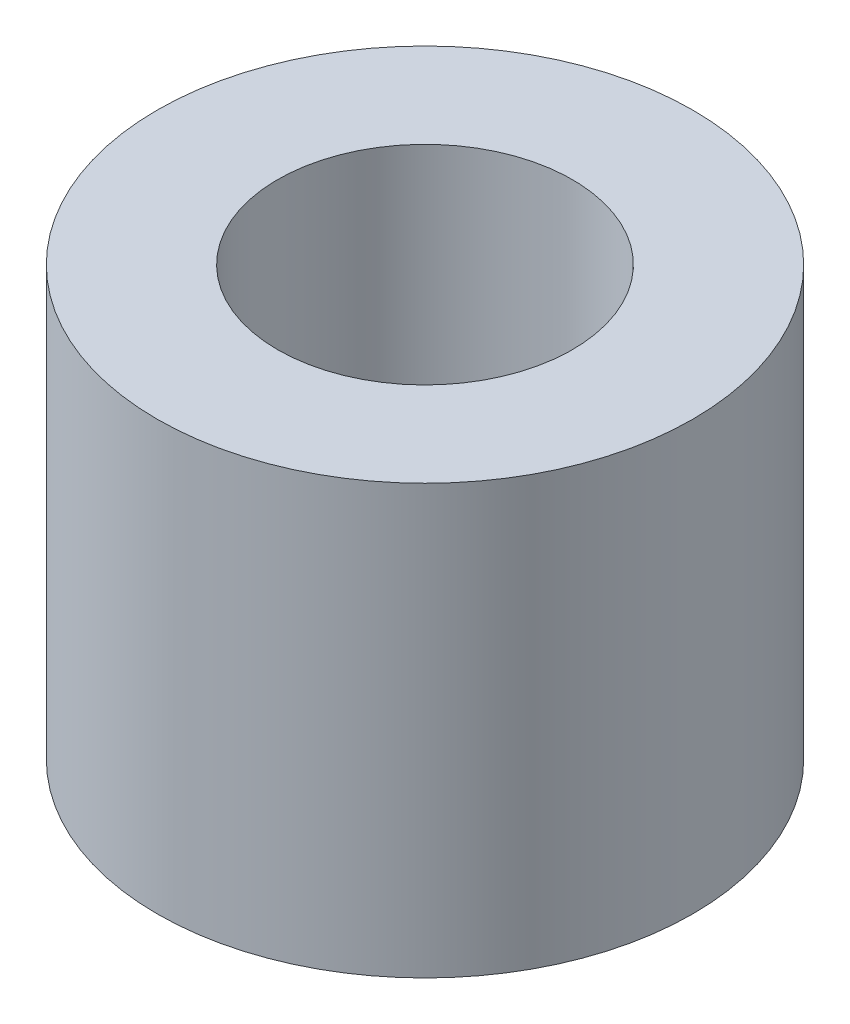
ISO-10303-21;
HEADER;
FILE_DESCRIPTION(('STEP AP214'),'2;1');
FILE_NAME('part.step','',(''),(''),'','','');
FILE_SCHEMA(('AUTOMOTIVE_DESIGN { 1 0 10303 214 1 1 1 1 }'));
ENDSEC;
DATA;
#1=APPLICATION_CONTEXT('core data for automotive mechanical design processes');
#2=APPLICATION_PROTOCOL_DEFINITION('international standard','automotive_design',2000,#1);
#3=PRODUCT_CONTEXT('',#1,'mechanical');
#4=PRODUCT('Part','Part','',(#3));
#5=PRODUCT_RELATED_PRODUCT_CATEGORY('part','',(#4));
#6=PRODUCT_DEFINITION_FORMATION('','',#4);
#7=PRODUCT_DEFINITION_CONTEXT('part definition',#1,'design');
#8=PRODUCT_DEFINITION('design','',#6,#7);
#9=PRODUCT_DEFINITION_SHAPE('','',#8);
#10=(LENGTH_UNIT() NAMED_UNIT(*) SI_UNIT(.MILLI.,.METRE.));
#11=(NAMED_UNIT(*) PLANE_ANGLE_UNIT() SI_UNIT($,.RADIAN.));
#12=(NAMED_UNIT(*) SI_UNIT($,.STERADIAN.) SOLID_ANGLE_UNIT());
#13=UNCERTAINTY_MEASURE_WITH_UNIT(LENGTH_MEASURE(1.E-05),#10,'distance_accuracy_value','');
#14=(GEOMETRIC_REPRESENTATION_CONTEXT(3) GLOBAL_UNCERTAINTY_ASSIGNED_CONTEXT((#13)) GLOBAL_UNIT_ASSIGNED_CONTEXT((#10,
#11,#12)) REPRESENTATION_CONTEXT('',''));
#15=CARTESIAN_POINT('',(0.,0.,0.));
#16=DIRECTION('',(0.,0.,1.));
#17=DIRECTION('',(1.,0.,0.));
#18=AXIS2_PLACEMENT_3D('',#15,#16,#17);
#19=CARTESIAN_POINT('',(0.,12.7,0.));
#20=DIRECTION('',(0.,1.,0.));
#21=DIRECTION('',(0.,0.,1.));
#22=AXIS2_PLACEMENT_3D('',#19,#20,#21);
#23=PLANE('',#22);
#24=CARTESIAN_POINT('',(0.,12.7,0.));
#25=DIRECTION('',(0.,1.,0.));
#26=DIRECTION('',(0.,0.,1.));
#27=AXIS2_PLACEMENT_3D('',#24,#25,#26);
#28=CIRCLE('',#27,7.9375);
#29=CARTESIAN_POINT('',(0.,12.7,7.9375));
#30=VERTEX_POINT('',#29);
#31=EDGE_CURVE('E10',#30,#30,#28,.T.);
#32=ORIENTED_EDGE('',*,*,#31,.T.);
#33=EDGE_LOOP('',(#32));
#34=FACE_BOUND('',#33,.T.);
#35=CARTESIAN_POINT('',(0.,12.7,0.));
#36=DIRECTION('',(0.,1.,0.));
#37=DIRECTION('',(0.,0.,1.));
#38=AXIS2_PLACEMENT_3D('',#35,#36,#37);
#39=CIRCLE('',#38,4.3688);
#40=CARTESIAN_POINT('',(0.,12.7,4.3688));
#41=VERTEX_POINT('',#40);
#42=EDGE_CURVE('E42',#41,#41,#39,.T.);
#43=ORIENTED_EDGE('',*,*,#42,.F.);
#44=EDGE_LOOP('',(#43));
#45=FACE_BOUND('',#44,.T.);
#46=ADVANCED_FACE('F31',(#34,#45),#23,.T.);
#47=CARTESIAN_POINT('',(0.,0.,0.));
#48=DIRECTION('',(0.,1.,0.));
#49=DIRECTION('',(0.,0.,1.));
#50=AXIS2_PLACEMENT_3D('',#47,#48,#49);
#51=PLANE('',#50);
#52=CARTESIAN_POINT('',(0.,0.,0.));
#53=DIRECTION('',(0.,1.,0.));
#54=DIRECTION('',(0.,0.,1.));
#55=AXIS2_PLACEMENT_3D('',#52,#53,#54);
#56=CIRCLE('',#55,7.9375);
#57=CARTESIAN_POINT('',(0.,0.,7.9375));
#58=VERTEX_POINT('',#57);
#59=EDGE_CURVE('E35',#58,#58,#56,.T.);
#60=ORIENTED_EDGE('',*,*,#59,.F.);
#61=EDGE_LOOP('',(#60));
#62=FACE_BOUND('',#61,.T.);
#63=CARTESIAN_POINT('',(0.,0.,0.));
#64=DIRECTION('',(0.,1.,0.));
#65=DIRECTION('',(0.,0.,1.));
#66=AXIS2_PLACEMENT_3D('',#63,#64,#65);
#67=CIRCLE('',#66,4.3688);
#68=CARTESIAN_POINT('',(0.,0.,4.3688));
#69=VERTEX_POINT('',#68);
#70=EDGE_CURVE('E44',#69,#69,#67,.T.);
#71=ORIENTED_EDGE('',*,*,#70,.T.);
#72=EDGE_LOOP('',(#71));
#73=FACE_BOUND('',#72,.T.);
#74=ADVANCED_FACE('F54',(#62,#73),#51,.F.);
#75=CARTESIAN_POINT('',(0.,12.7,0.));
#76=DIRECTION('',(0.,-1.,0.));
#77=DIRECTION('',(0.,0.,-1.));
#78=AXIS2_PLACEMENT_3D('',#75,#76,#77);
#79=CYLINDRICAL_SURFACE('',#78,7.9375);
#80=ORIENTED_EDGE('',*,*,#31,.F.);
#81=EDGE_LOOP('',(#80));
#82=FACE_BOUND('',#81,.T.);
#83=ORIENTED_EDGE('',*,*,#59,.T.);
#84=EDGE_LOOP('',(#83));
#85=FACE_BOUND('',#84,.T.);
#86=ADVANCED_FACE('F33',(#82,#85),#79,.T.);
#87=CARTESIAN_POINT('',(0.,12.7,0.));
#88=DIRECTION('',(0.,-1.,0.));
#89=DIRECTION('',(0.,0.,-1.));
#90=AXIS2_PLACEMENT_3D('',#87,#88,#89);
#91=CYLINDRICAL_SURFACE('',#90,4.3688);
#92=ORIENTED_EDGE('',*,*,#42,.T.);
#93=EDGE_LOOP('',(#92));
#94=FACE_BOUND('',#93,.T.);
#95=ORIENTED_EDGE('',*,*,#70,.F.);
#96=EDGE_LOOP('',(#95));
#97=FACE_BOUND('',#96,.T.);
#98=ADVANCED_FACE('F50',(#94,#97),#91,.F.);
#99=CLOSED_SHELL('',(#46,#74,#86,#98));
#100=MANIFOLD_SOLID_BREP('B2',#99);
#101=ADVANCED_BREP_SHAPE_REPRESENTATION('',(#18,#100),#14);
#102=SHAPE_DEFINITION_REPRESENTATION(#9,#101);
ENDSEC;
END-ISO-10303-21;
